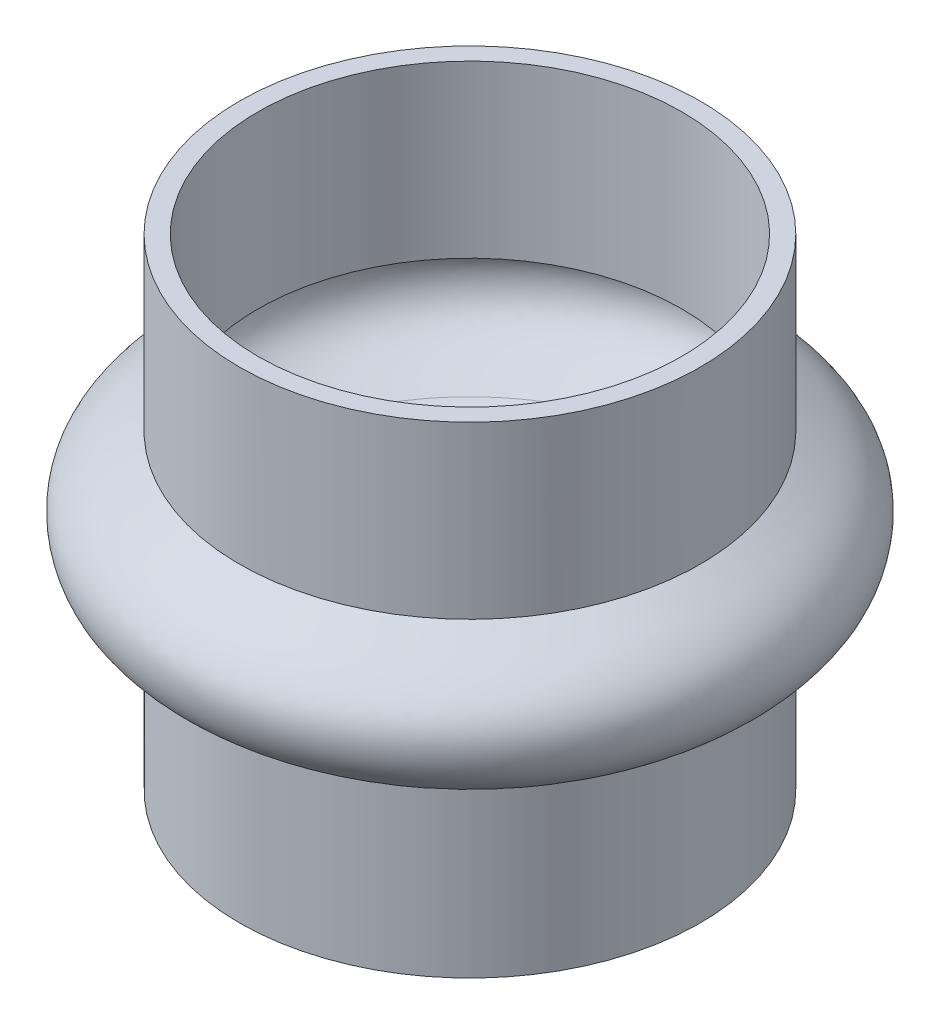
ISO-10303-21;
HEADER;
FILE_DESCRIPTION(('STEP AP214'),'2;1');
FILE_NAME('part.step','',(''),(''),'','','');
FILE_SCHEMA(('AUTOMOTIVE_DESIGN { 1 0 10303 214 1 1 1 1 }'));
ENDSEC;
DATA;
#1=APPLICATION_CONTEXT('core data for automotive mechanical design processes');
#2=APPLICATION_PROTOCOL_DEFINITION('international standard','automotive_design',2000,#1);
#3=PRODUCT_CONTEXT('',#1,'mechanical');
#4=PRODUCT('Part','Part','',(#3));
#5=PRODUCT_RELATED_PRODUCT_CATEGORY('part','',(#4));
#6=PRODUCT_DEFINITION_FORMATION('','',#4);
#7=PRODUCT_DEFINITION_CONTEXT('part definition',#1,'design');
#8=PRODUCT_DEFINITION('design','',#6,#7);
#9=PRODUCT_DEFINITION_SHAPE('','',#8);
#10=(LENGTH_UNIT() NAMED_UNIT(*) SI_UNIT(.MILLI.,.METRE.));
#11=(NAMED_UNIT(*) PLANE_ANGLE_UNIT() SI_UNIT($,.RADIAN.));
#12=(NAMED_UNIT(*) SI_UNIT($,.STERADIAN.) SOLID_ANGLE_UNIT());
#13=UNCERTAINTY_MEASURE_WITH_UNIT(LENGTH_MEASURE(1.E-05),#10,'distance_accuracy_value','');
#14=(GEOMETRIC_REPRESENTATION_CONTEXT(3) GLOBAL_UNCERTAINTY_ASSIGNED_CONTEXT((#13)) GLOBAL_UNIT_ASSIGNED_CONTEXT((#10,
#11,#12)) REPRESENTATION_CONTEXT('',''));
#15=CARTESIAN_POINT('',(0.,0.,0.));
#16=DIRECTION('',(0.,0.,1.));
#17=DIRECTION('',(1.,0.,0.));
#18=AXIS2_PLACEMENT_3D('',#15,#16,#17);
#19=CARTESIAN_POINT('',(7.32527885416046,63.4118839536714,0.));
#20=CARTESIAN_POINT('',(6.01113524448012,62.7300548837443,0.));
#21=CARTESIAN_POINT('',(2.97178340482834,61.4251647000728,0.));
#22=CARTESIAN_POINT('',(3.46335156981875,56.9126049959074,0.));
#23=CARTESIAN_POINT('',(5.94264008540045,55.867892062733,0.));
#24=CARTESIAN_POINT('',(7.13175859484,55.2111567601479,0.));
#25=B_SPLINE_CURVE_WITH_KNOTS('',3,(#19,#20,#21,#22,#23,#24),.UNSPECIFIED.,.F.,.F.,(4,1,1,4),
(0.,0.430000258288569,0.624673055244475,1.),.UNSPECIFIED.);
#26=CARTESIAN_POINT('',(20.8252788541605,76.5393428738392,0.));
#27=DIRECTION('',(0.,1.,0.));
#28=AXIS1_PLACEMENT('',#26,#27);
#29=SURFACE_OF_REVOLUTION('',#25,#28);
#30=CARTESIAN_POINT('',(20.8252788541605,55.211156760148,0.));
#31=DIRECTION('',(0.,1.,0.));
#32=DIRECTION('',(-1.,0.,0.));
#33=AXIS2_PLACEMENT_3D('',#30,#31,#32);
#34=CIRCLE('',#33,13.6935202593205);
#35=CARTESIAN_POINT('',(7.13175859484001,55.211156760148,0.));
#36=VERTEX_POINT('',#35);
#37=EDGE_CURVE('E10',#36,#36,#34,.T.);
#38=ORIENTED_EDGE('',*,*,#37,.T.);
#39=EDGE_LOOP('',(#38));
#40=FACE_BOUND('',#39,.T.);
#41=CARTESIAN_POINT('',(20.8252788541605,63.4118839536714,0.));
#42=DIRECTION('',(0.,1.,0.));
#43=DIRECTION('',(-1.,0.,0.));
#44=AXIS2_PLACEMENT_3D('',#41,#42,#43);
#45=CIRCLE('',#44,13.5);
#46=CARTESIAN_POINT('',(7.32527885416046,63.4118839536714,0.));
#47=VERTEX_POINT('',#46);
#48=EDGE_CURVE('E61',#47,#47,#45,.T.);
#49=ORIENTED_EDGE('',*,*,#48,.F.);
#50=EDGE_LOOP('',(#49));
#51=FACE_BOUND('',#50,.T.);
#52=ADVANCED_FACE('F37',(#40,#51),#29,.F.);
#53=CARTESIAN_POINT('',(8.16598021867365,55.211156760148,0.));
#54=DIRECTION('',(0.,-1.,0.));
#55=DIRECTION('',(1.,0.,0.));
#56=AXIS2_PLACEMENT_3D('',#53,#54,#55);
#57=PLANE('',#56);
#58=CARTESIAN_POINT('',(20.8252788541605,55.2111567601479,0.));
#59=DIRECTION('',(0.,1.,0.));
#60=DIRECTION('',(0.,0.,1.));
#61=AXIS2_PLACEMENT_3D('',#58,#59,#60);
#62=CIRCLE('',#61,13.5);
#63=CARTESIAN_POINT('',(20.8252788541605,55.2111567601479,13.5));
#64=VERTEX_POINT('',#63);
#65=EDGE_CURVE('E96',#64,#64,#62,.T.);
#66=ORIENTED_EDGE('',*,*,#65,.T.);
#67=EDGE_LOOP('',(#66));
#68=FACE_BOUND('',#67,.T.);
#69=ORIENTED_EDGE('',*,*,#37,.F.);
#70=EDGE_LOOP('',(#69));
#71=FACE_BOUND('',#70,.T.);
#72=ADVANCED_FACE('F86',(#68,#71),#57,.T.);
#73=CARTESIAN_POINT('',(20.8252788541605,55.211156760148,0.));
#74=DIRECTION('',(0.,1.,0.));
#75=DIRECTION('',(-1.,0.,0.));
#76=AXIS2_PLACEMENT_3D('',#73,#74,#75);
#77=CONICAL_SURFACE('',#76,12.6592986354868,1.0661985655365);
#78=CARTESIAN_POINT('',(20.8252788541605,55.6488412650065,0.));
#79=DIRECTION('',(0.,1.,0.));
#80=DIRECTION('',(-1.,0.,0.));
#81=AXIS2_PLACEMENT_3D('',#78,#79,#80);
#82=CIRCLE('',#81,13.4517925732629);
#83=CARTESIAN_POINT('',(7.37348628089757,55.6488412650065,0.));
#84=VERTEX_POINT('',#83);
#85=EDGE_CURVE('E50',#84,#84,#82,.T.);
#86=ORIENTED_EDGE('',*,*,#85,.T.);
#87=EDGE_LOOP('',(#86));
#88=FACE_BOUND('',#87,.T.);
#89=CARTESIAN_POINT('',(20.8252788541605,55.211156760148,0.));
#90=DIRECTION('',(0.,1.,0.));
#91=DIRECTION('',(-1.,0.,0.));
#92=AXIS2_PLACEMENT_3D('',#89,#90,#91);
#93=CIRCLE('',#92,12.6592986354868);
#94=CARTESIAN_POINT('',(8.16598021867365,55.211156760148,0.));
#95=VERTEX_POINT('',#94);
#96=EDGE_CURVE('E45',#95,#95,#93,.T.);
#97=ORIENTED_EDGE('',*,*,#96,.F.);
#98=EDGE_LOOP('',(#97));
#99=FACE_BOUND('',#98,.T.);
#100=ADVANCED_FACE('F82',(#88,#99),#77,.F.);
#101=CARTESIAN_POINT('',(7.37348628089757,55.6488412650065,0.));
#102=CARTESIAN_POINT('',(6.94927786526421,55.8831262752797,0.));
#103=CARTESIAN_POINT('',(6.08596344010193,56.3113793414857,0.));
#104=CARTESIAN_POINT('',(4.83183781803493,57.1065516861268,0.));
#105=CARTESIAN_POINT('',(3.98998944217818,58.0646968706636,0.));
#106=CARTESIAN_POINT('',(3.73463050414133,59.1781793514421,0.));
#107=CARTESIAN_POINT('',(3.84359558060863,60.0137583984932,0.));
#108=CARTESIAN_POINT('',(4.15954484014883,60.7257045834839,0.));
#109=CARTESIAN_POINT('',(4.95450233993011,61.5405908742814,0.));
#110=CARTESIAN_POINT('',(6.05410486957729,62.2018426288294,0.));
#111=CARTESIAN_POINT('',(6.94714467288609,62.6603874787557,0.));
#112=CARTESIAN_POINT('',(7.34999990981553,62.8614176513628,0.));
#113=CARTESIAN_POINT('',(7.55554955647946,62.9680648422606,0.));
#114=B_SPLINE_CURVE_WITH_KNOTS('',3,(#101,#102,#103,#104,#105,#106,#107,#108,#109,#110,#111,
#112,#113),.UNSPECIFIED.,.F.,.F.,(4,1,1,1,1,1,1,1,1,1,4),(0.,0.125,0.25,0.375,0.5,0.5625,0.625,
0.75,0.875,0.9375,1.),.UNSPECIFIED.);
#115=CARTESIAN_POINT('',(20.8252788541605,76.5393428738392,0.));
#116=DIRECTION('',(0.,1.,0.));
#117=AXIS1_PLACEMENT('',#115,#116);
#118=SURFACE_OF_REVOLUTION('',#114,#117);
#119=CARTESIAN_POINT('',(20.8252788541605,62.9680648422606,0.));
#120=DIRECTION('',(0.,1.,0.));
#121=DIRECTION('',(-1.,0.,0.));
#122=AXIS2_PLACEMENT_3D('',#119,#120,#121);
#123=CIRCLE('',#122,13.269729297681);
#124=CARTESIAN_POINT('',(7.55554955647947,62.9680648422606,0.));
#125=VERTEX_POINT('',#124);
#126=EDGE_CURVE('E55',#125,#125,#123,.T.);
#127=ORIENTED_EDGE('',*,*,#126,.T.);
#128=EDGE_LOOP('',(#127));
#129=FACE_BOUND('',#128,.T.);
#130=ORIENTED_EDGE('',*,*,#85,.F.);
#131=EDGE_LOOP('',(#130));
#132=FACE_BOUND('',#131,.T.);
#133=ADVANCED_FACE('F77',(#129,#132),#118,.F.);
#134=CARTESIAN_POINT('',(20.8252788541605,62.9680648422606,0.));
#135=DIRECTION('',(0.,-1.,0.));
#136=DIRECTION('',(1.,0.,0.));
#137=AXIS2_PLACEMENT_3D('',#134,#135,#136);
#138=CONICAL_SURFACE('',#137,13.269729297681,1.09219128631746);
#139=CARTESIAN_POINT('',(20.8252788541605,63.4118839536714,0.));
#140=DIRECTION('',(0.,1.,0.));
#141=DIRECTION('',(0.,0.,1.));
#142=AXIS2_PLACEMENT_3D('',#139,#140,#141);
#143=CIRCLE('',#142,12.4143212858505);
#144=CARTESIAN_POINT('',(20.8252788541605,63.4118839536714,12.4143212858505));
#145=VERTEX_POINT('',#144);
#146=EDGE_CURVE('E105',#145,#145,#143,.T.);
#147=ORIENTED_EDGE('',*,*,#146,.T.);
#148=EDGE_LOOP('',(#147));
#149=FACE_BOUND('',#148,.T.);
#150=ORIENTED_EDGE('',*,*,#126,.F.);
#151=EDGE_LOOP('',(#150));
#152=FACE_BOUND('',#151,.T.);
#153=ADVANCED_FACE('F81',(#149,#152),#138,.F.);
#154=CARTESIAN_POINT('',(20.8252788541605,73.4118839536714,0.));
#155=DIRECTION('',(0.,1.,0.));
#156=DIRECTION('',(0.,0.,1.));
#157=AXIS2_PLACEMENT_3D('',#154,#155,#156);
#158=PLANE('',#157);
#159=CARTESIAN_POINT('',(20.8252788541605,73.4118839536714,0.));
#160=DIRECTION('',(0.,1.,0.));
#161=DIRECTION('',(0.,0.,1.));
#162=AXIS2_PLACEMENT_3D('',#159,#160,#161);
#163=CIRCLE('',#162,13.5);
#164=CARTESIAN_POINT('',(20.8252788541605,73.4118839536714,13.5));
#165=VERTEX_POINT('',#164);
#166=EDGE_CURVE('E65',#165,#165,#163,.T.);
#167=ORIENTED_EDGE('',*,*,#166,.T.);
#168=EDGE_LOOP('',(#167));
#169=FACE_BOUND('',#168,.T.);
#170=CARTESIAN_POINT('',(20.8252788541605,73.4118839536714,0.));
#171=DIRECTION('',(0.,1.,0.));
#172=DIRECTION('',(0.,0.,1.));
#173=AXIS2_PLACEMENT_3D('',#170,#171,#172);
#174=CIRCLE('',#173,12.4143212858505);
#175=CARTESIAN_POINT('',(20.8252788541605,73.4118839536714,12.4143212858505));
#176=VERTEX_POINT('',#175);
#177=EDGE_CURVE('E112',#176,#176,#174,.T.);
#178=ORIENTED_EDGE('',*,*,#177,.F.);
#179=EDGE_LOOP('',(#178));
#180=FACE_BOUND('',#179,.T.);
#181=ADVANCED_FACE('F122',(#169,#180),#158,.T.);
#182=CARTESIAN_POINT('',(20.8252788541605,73.4118839536714,0.));
#183=DIRECTION('',(0.,-1.,0.));
#184=DIRECTION('',(0.,0.,-1.));
#185=AXIS2_PLACEMENT_3D('',#182,#183,#184);
#186=CYLINDRICAL_SURFACE('',#185,13.5);
#187=ORIENTED_EDGE('',*,*,#166,.F.);
#188=EDGE_LOOP('',(#187));
#189=FACE_BOUND('',#188,.T.);
#190=ORIENTED_EDGE('',*,*,#48,.T.);
#191=EDGE_LOOP('',(#190));
#192=FACE_BOUND('',#191,.T.);
#193=ADVANCED_FACE('F125',(#189,#192),#186,.T.);
#194=CARTESIAN_POINT('',(20.8252788541605,73.4118839536714,0.));
#195=DIRECTION('',(0.,-1.,0.));
#196=DIRECTION('',(0.,0.,-1.));
#197=AXIS2_PLACEMENT_3D('',#194,#195,#196);
#198=CYLINDRICAL_SURFACE('',#197,12.4143212858505);
#199=ORIENTED_EDGE('',*,*,#177,.T.);
#200=EDGE_LOOP('',(#199));
#201=FACE_BOUND('',#200,.T.);
#202=ORIENTED_EDGE('',*,*,#146,.F.);
#203=EDGE_LOOP('',(#202));
#204=FACE_BOUND('',#203,.T.);
#205=ADVANCED_FACE('F128',(#201,#204),#198,.F.);
#206=CARTESIAN_POINT('',(20.8252788541605,55.2111567601479,0.));
#207=DIRECTION('',(0.,-1.,0.));
#208=DIRECTION('',(0.,0.,1.));
#209=AXIS2_PLACEMENT_3D('',#206,#207,#208);
#210=PLANE('',#209);
#211=CARTESIAN_POINT('',(20.8252788541605,55.2111567601479,0.));
#212=DIRECTION('',(0.,1.,0.));
#213=DIRECTION('',(0.,0.,1.));
#214=AXIS2_PLACEMENT_3D('',#211,#212,#213);
#215=CIRCLE('',#214,12.4143212858505);
#216=CARTESIAN_POINT('',(20.8252788541605,55.2111567601479,12.4143212858505));
#217=VERTEX_POINT('',#216);
#218=EDGE_CURVE('E108',#217,#217,#215,.T.);
#219=ORIENTED_EDGE('',*,*,#218,.F.);
#220=EDGE_LOOP('',(#219));
#221=FACE_BOUND('',#220,.T.);
#222=ORIENTED_EDGE('',*,*,#96,.T.);
#223=EDGE_LOOP('',(#222));
#224=FACE_BOUND('',#223,.T.);
#225=ADVANCED_FACE('F135',(#221,#224),#210,.F.);
#226=CARTESIAN_POINT('',(20.8252788541605,45.2111567601479,0.));
#227=DIRECTION('',(0.,1.,0.));
#228=DIRECTION('',(0.,0.,1.));
#229=AXIS2_PLACEMENT_3D('',#226,#227,#228);
#230=CYLINDRICAL_SURFACE('',#229,13.5);
#231=CARTESIAN_POINT('',(20.8252788541605,45.2111567601479,0.));
#232=DIRECTION('',(0.,1.,0.));
#233=DIRECTION('',(0.,0.,1.));
#234=AXIS2_PLACEMENT_3D('',#231,#232,#233);
#235=CIRCLE('',#234,13.5);
#236=CARTESIAN_POINT('',(20.8252788541605,45.2111567601479,13.5));
#237=VERTEX_POINT('',#236);
#238=EDGE_CURVE('E99',#237,#237,#235,.T.);
#239=ORIENTED_EDGE('',*,*,#238,.T.);
#240=EDGE_LOOP('',(#239));
#241=FACE_BOUND('',#240,.T.);
#242=ORIENTED_EDGE('',*,*,#65,.F.);
#243=EDGE_LOOP('',(#242));
#244=FACE_BOUND('',#243,.T.);
#245=ADVANCED_FACE('F140',(#241,#244),#230,.T.);
#246=CARTESIAN_POINT('',(20.8252788541605,45.2111567601479,0.));
#247=DIRECTION('',(0.,-1.,0.));
#248=DIRECTION('',(0.,0.,1.));
#249=AXIS2_PLACEMENT_3D('',#246,#247,#248);
#250=PLANE('',#249);
#251=CARTESIAN_POINT('',(20.8252788541605,45.2111567601479,0.));
#252=DIRECTION('',(0.,1.,0.));
#253=DIRECTION('',(0.,0.,1.));
#254=AXIS2_PLACEMENT_3D('',#251,#252,#253);
#255=CIRCLE('',#254,12.4143212858505);
#256=CARTESIAN_POINT('',(20.8252788541605,45.2111567601479,12.4143212858505));
#257=VERTEX_POINT('',#256);
#258=EDGE_CURVE('E100',#257,#257,#255,.T.);
#259=ORIENTED_EDGE('',*,*,#258,.T.);
#260=EDGE_LOOP('',(#259));
#261=FACE_BOUND('',#260,.T.);
#262=ORIENTED_EDGE('',*,*,#238,.F.);
#263=EDGE_LOOP('',(#262));
#264=FACE_BOUND('',#263,.T.);
#265=ADVANCED_FACE('F143',(#261,#264),#250,.T.);
#266=CARTESIAN_POINT('',(20.8252788541605,45.2111567601479,0.));
#267=DIRECTION('',(0.,1.,0.));
#268=DIRECTION('',(0.,0.,1.));
#269=AXIS2_PLACEMENT_3D('',#266,#267,#268);
#270=CYLINDRICAL_SURFACE('',#269,12.4143212858505);
#271=ORIENTED_EDGE('',*,*,#258,.F.);
#272=EDGE_LOOP('',(#271));
#273=FACE_BOUND('',#272,.T.);
#274=ORIENTED_EDGE('',*,*,#218,.T.);
#275=EDGE_LOOP('',(#274));
#276=FACE_BOUND('',#275,.T.);
#277=ADVANCED_FACE('F150',(#273,#276),#270,.F.);
#278=CLOSED_SHELL('',(#52,#72,#100,#133,#153,#181,#193,#205,#225,#245,#265,#277));
#279=MANIFOLD_SOLID_BREP('B2',#278);
#280=ADVANCED_BREP_SHAPE_REPRESENTATION('',(#18,#279),#14);
#281=SHAPE_DEFINITION_REPRESENTATION(#9,#280);
ENDSEC;
END-ISO-10303-21;
